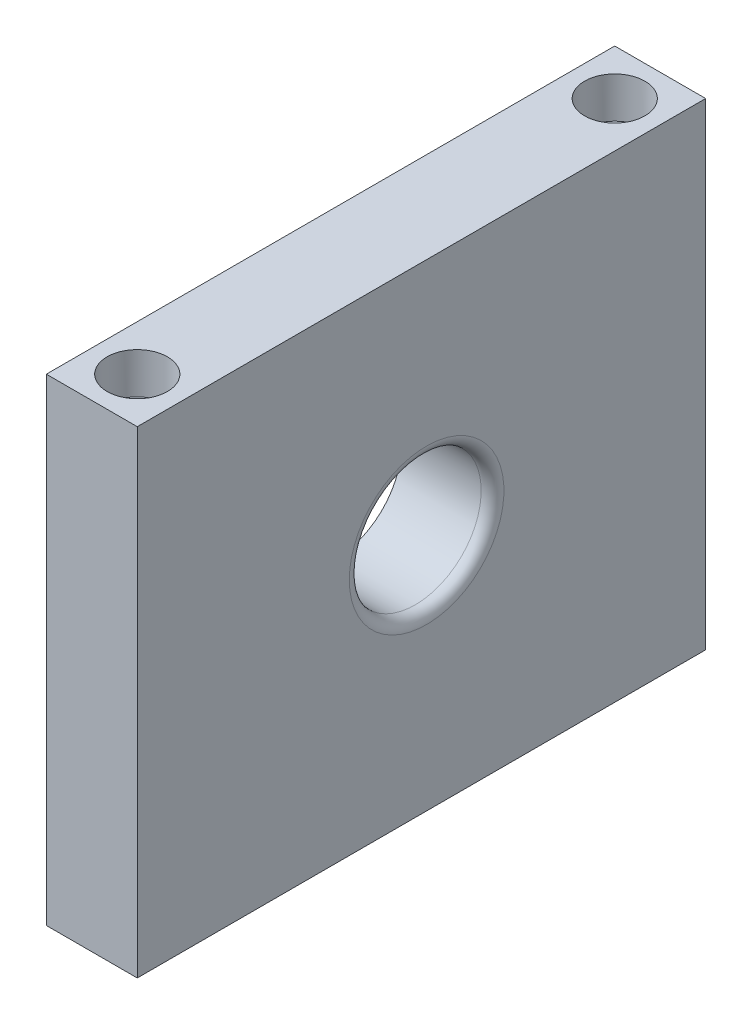
ISO-10303-21;
HEADER;
FILE_DESCRIPTION(('STEP AP214'),'2;1');
FILE_NAME('part.step','',(''),(''),'','','');
FILE_SCHEMA(('AUTOMOTIVE_DESIGN { 1 0 10303 214 1 1 1 1 }'));
ENDSEC;
DATA;
#1=APPLICATION_CONTEXT('core data for automotive mechanical design processes');
#2=APPLICATION_PROTOCOL_DEFINITION('international standard','automotive_design',2000,#1);
#3=PRODUCT_CONTEXT('',#1,'mechanical');
#4=PRODUCT('Part','Part','',(#3));
#5=PRODUCT_RELATED_PRODUCT_CATEGORY('part','',(#4));
#6=PRODUCT_DEFINITION_FORMATION('','',#4);
#7=PRODUCT_DEFINITION_CONTEXT('part definition',#1,'design');
#8=PRODUCT_DEFINITION('design','',#6,#7);
#9=PRODUCT_DEFINITION_SHAPE('','',#8);
#10=(LENGTH_UNIT() NAMED_UNIT(*) SI_UNIT(.MILLI.,.METRE.));
#11=(NAMED_UNIT(*) PLANE_ANGLE_UNIT() SI_UNIT($,.RADIAN.));
#12=(NAMED_UNIT(*) SI_UNIT($,.STERADIAN.) SOLID_ANGLE_UNIT());
#13=UNCERTAINTY_MEASURE_WITH_UNIT(LENGTH_MEASURE(1.E-05),#10,'distance_accuracy_value','');
#14=(GEOMETRIC_REPRESENTATION_CONTEXT(3) GLOBAL_UNCERTAINTY_ASSIGNED_CONTEXT((#13)) GLOBAL_UNIT_ASSIGNED_CONTEXT((#10,
#11,#12)) REPRESENTATION_CONTEXT('',''));
#15=CARTESIAN_POINT('',(0.,0.,0.));
#16=DIRECTION('',(0.,0.,1.));
#17=DIRECTION('',(1.,0.,0.));
#18=AXIS2_PLACEMENT_3D('',#15,#16,#17);
#19=CARTESIAN_POINT('',(-14.2230483271375,-3.6,-32.3847583643123));
#20=DIRECTION('',(0.,1.,0.));
#21=DIRECTION('',(0.,0.,1.));
#22=AXIS2_PLACEMENT_3D('',#19,#20,#21);
#23=PLANE('',#22);
#24=CARTESIAN_POINT('',(-14.2230483271375,-3.6,-32.3847583643123));
#25=DIRECTION('',(0.,1.,0.));
#26=DIRECTION('',(0.,0.,1.));
#27=AXIS2_PLACEMENT_3D('',#24,#25,#26);
#28=CIRCLE('',#27,2.65);
#29=CARTESIAN_POINT('',(-14.2230483271375,-3.6,-29.7347583643123));
#30=VERTEX_POINT('',#29);
#31=EDGE_CURVE('E122',#30,#30,#28,.T.);
#32=ORIENTED_EDGE('',*,*,#31,.T.);
#33=EDGE_LOOP('',(#32));
#34=FACE_BOUND('',#33,.T.);
#35=ADVANCED_FACE('F41',(#34),#23,.T.);
#36=CARTESIAN_POINT('',(-14.2230483271375,-3.6,-32.3847583643123));
#37=DIRECTION('',(0.,1.,0.));
#38=DIRECTION('',(0.,0.,1.));
#39=AXIS2_PLACEMENT_3D('',#36,#37,#38);
#40=CYLINDRICAL_SURFACE('',#39,2.65);
#41=CARTESIAN_POINT('',(-14.2230483271375,0.,-32.3847583643123));
#42=DIRECTION('',(0.,-1.,0.));
#43=DIRECTION('',(0.,0.,-1.));
#44=AXIS2_PLACEMENT_3D('',#41,#42,#43);
#45=CIRCLE('',#44,2.65);
#46=CARTESIAN_POINT('',(-14.2230483271375,0.,-35.0347583643123));
#47=VERTEX_POINT('',#46);
#48=EDGE_CURVE('E162',#47,#47,#45,.F.);
#49=ORIENTED_EDGE('',*,*,#48,.T.);
#50=EDGE_LOOP('',(#49));
#51=FACE_BOUND('',#50,.T.);
#52=ORIENTED_EDGE('',*,*,#31,.F.);
#53=EDGE_LOOP('',(#52));
#54=FACE_BOUND('',#53,.T.);
#55=ADVANCED_FACE('F192',(#51,#54),#40,.F.);
#56=CARTESIAN_POINT('',(14.7769516728625,0.,-36.3847583643123));
#57=DIRECTION('',(0.,-1.,0.));
#58=DIRECTION('',(0.,0.,-1.));
#59=AXIS2_PLACEMENT_3D('',#56,#57,#58);
#60=PLANE('',#59);
#61=DIRECTION('',(0.,0.,1.));
#62=VECTOR('',#61,1.);
#63=CARTESIAN_POINT('',(-18.2230483271375,0.,0.));
#64=LINE('',#63,#62);
#65=CARTESIAN_POINT('',(-18.2230483271376,0.,-36.3847583643123));
#66=VERTEX_POINT('',#65);
#67=CARTESIAN_POINT('',(-18.2230483271375,0.,13.6152416356877));
#68=VERTEX_POINT('',#67);
#69=EDGE_CURVE('E80',#66,#68,#64,.T.);
#70=ORIENTED_EDGE('',*,*,#69,.T.);
#71=DIRECTION('',(1.,0.,0.));
#72=VECTOR('',#71,1.);
#73=CARTESIAN_POINT('',(14.7769516728625,0.,13.6152416356877));
#74=LINE('',#73,#72);
#75=CARTESIAN_POINT('',(-10.2230483271376,0.,13.6152416356877));
#76=VERTEX_POINT('',#75);
#77=EDGE_CURVE('E83',#68,#76,#74,.T.);
#78=ORIENTED_EDGE('',*,*,#77,.T.);
#79=DIRECTION('',(0.,0.,1.));
#80=VECTOR('',#79,1.);
#81=CARTESIAN_POINT('',(-10.2230483271376,0.,-36.3847583643123));
#82=LINE('',#81,#80);
#83=CARTESIAN_POINT('',(-10.2230483271376,0.,-36.3847583643123));
#84=VERTEX_POINT('',#83);
#85=EDGE_CURVE('E119',#84,#76,#82,.T.);
#86=ORIENTED_EDGE('',*,*,#85,.F.);
#87=DIRECTION('',(1.,0.,0.));
#88=VECTOR('',#87,1.);
#89=CARTESIAN_POINT('',(14.7769516728625,0.,-36.3847583643123));
#90=LINE('',#89,#88);
#91=EDGE_CURVE('E86',#66,#84,#90,.T.);
#92=ORIENTED_EDGE('',*,*,#91,.F.);
#93=EDGE_LOOP('',(#70,#78,#86,#92));
#94=FACE_BOUND('',#93,.T.);
#95=CARTESIAN_POINT('',(-14.2230483271375,0.,9.61524163568773));
#96=DIRECTION('',(0.,-1.,0.));
#97=DIRECTION('',(0.,0.,-1.));
#98=AXIS2_PLACEMENT_3D('',#95,#96,#97);
#99=CIRCLE('',#98,2.65);
#100=CARTESIAN_POINT('',(-14.2230483271375,0.,6.96524163568774));
#101=VERTEX_POINT('',#100);
#102=EDGE_CURVE('E91',#101,#101,#99,.F.);
#103=ORIENTED_EDGE('',*,*,#102,.F.);
#104=EDGE_LOOP('',(#103));
#105=FACE_BOUND('',#104,.T.);
#106=ORIENTED_EDGE('',*,*,#48,.F.);
#107=EDGE_LOOP('',(#106));
#108=FACE_BOUND('',#107,.T.);
#109=ADVANCED_FACE('F81',(#94,#105,#108),#60,.F.);
#110=CARTESIAN_POINT('',(-14.2230483271375,-3.6,9.61524163568773));
#111=DIRECTION('',(0.,1.,0.));
#112=DIRECTION('',(0.,0.,1.));
#113=AXIS2_PLACEMENT_3D('',#110,#111,#112);
#114=PLANE('',#113);
#115=CARTESIAN_POINT('',(-14.2230483271375,-3.6,9.61524163568773));
#116=DIRECTION('',(0.,1.,0.));
#117=DIRECTION('',(0.,0.,1.));
#118=AXIS2_PLACEMENT_3D('',#115,#116,#117);
#119=CIRCLE('',#118,2.65);
#120=CARTESIAN_POINT('',(-14.2230483271375,-3.6,12.2652416356877));
#121=VERTEX_POINT('',#120);
#122=EDGE_CURVE('E133',#121,#121,#119,.T.);
#123=ORIENTED_EDGE('',*,*,#122,.T.);
#124=EDGE_LOOP('',(#123));
#125=FACE_BOUND('',#124,.T.);
#126=ADVANCED_FACE('F202',(#125),#114,.T.);
#127=CARTESIAN_POINT('',(-14.2230483271375,-3.6,9.61524163568773));
#128=DIRECTION('',(0.,1.,0.));
#129=DIRECTION('',(0.,0.,1.));
#130=AXIS2_PLACEMENT_3D('',#127,#128,#129);
#131=CYLINDRICAL_SURFACE('',#130,2.65);
#132=ORIENTED_EDGE('',*,*,#102,.T.);
#133=EDGE_LOOP('',(#132));
#134=FACE_BOUND('',#133,.T.);
#135=ORIENTED_EDGE('',*,*,#122,.F.);
#136=EDGE_LOOP('',(#135));
#137=FACE_BOUND('',#136,.T.);
#138=ADVANCED_FACE('F204',(#134,#137),#131,.F.);
#139=CARTESIAN_POINT('',(-10.2230483271375,3.,13.6152416356877));
#140=DIRECTION('',(0.,0.,-1.));
#141=DIRECTION('',(-1.,0.,0.));
#142=AXIS2_PLACEMENT_3D('',#139,#140,#141);
#143=PLANE('',#142);
#144=DIRECTION('',(0.,1.,0.));
#145=VECTOR('',#144,1.);
#146=CARTESIAN_POINT('',(-10.2230483271376,-42.,13.6152416356877));
#147=LINE('',#146,#145);
#148=CARTESIAN_POINT('',(-10.2230483271376,-42.,13.6152416356877));
#149=VERTEX_POINT('',#148);
#150=EDGE_CURVE('E96',#149,#76,#147,.T.);
#151=ORIENTED_EDGE('',*,*,#150,.T.);
#152=ORIENTED_EDGE('',*,*,#77,.F.);
#153=DIRECTION('',(0.,1.,0.));
#154=VECTOR('',#153,1.);
#155=CARTESIAN_POINT('',(-18.2230483271375,3.,13.6152416356877));
#156=LINE('',#155,#154);
#157=CARTESIAN_POINT('',(-18.2230483271376,-42.,13.6152416356877));
#158=VERTEX_POINT('',#157);
#159=EDGE_CURVE('E58',#158,#68,#156,.T.);
#160=ORIENTED_EDGE('',*,*,#159,.F.);
#161=DIRECTION('',(-1.,0.,0.));
#162=VECTOR('',#161,1.);
#163=CARTESIAN_POINT('',(-18.2230483271376,-42.,13.6152416356877));
#164=LINE('',#163,#162);
#165=EDGE_CURVE('E118',#149,#158,#164,.T.);
#166=ORIENTED_EDGE('',*,*,#165,.F.);
#167=EDGE_LOOP('',(#151,#152,#160,#166));
#168=FACE_BOUND('',#167,.T.);
#169=ADVANCED_FACE('F94',(#168),#143,.F.);
#170=CARTESIAN_POINT('',(-10.2230483271376,3.,-36.3847583643123));
#171=DIRECTION('',(0.,0.,1.));
#172=DIRECTION('',(1.,0.,0.));
#173=AXIS2_PLACEMENT_3D('',#170,#171,#172);
#174=PLANE('',#173);
#175=DIRECTION('',(0.,-1.,0.));
#176=VECTOR('',#175,1.);
#177=CARTESIAN_POINT('',(-18.2230483271376,3.,-36.3847583643123));
#178=LINE('',#177,#176);
#179=CARTESIAN_POINT('',(-18.2230483271376,-42.,-36.3847583643123));
#180=VERTEX_POINT('',#179);
#181=EDGE_CURVE('E105',#66,#180,#178,.T.);
#182=ORIENTED_EDGE('',*,*,#181,.F.);
#183=ORIENTED_EDGE('',*,*,#91,.T.);
#184=DIRECTION('',(0.,1.,0.));
#185=VECTOR('',#184,1.);
#186=CARTESIAN_POINT('',(-10.2230483271376,-42.,-36.3847583643123));
#187=LINE('',#186,#185);
#188=CARTESIAN_POINT('',(-10.2230483271376,-42.,-36.3847583643123));
#189=VERTEX_POINT('',#188);
#190=EDGE_CURVE('E110',#189,#84,#187,.T.);
#191=ORIENTED_EDGE('',*,*,#190,.F.);
#192=DIRECTION('',(1.,0.,0.));
#193=VECTOR('',#192,1.);
#194=CARTESIAN_POINT('',(-18.2230483271376,-42.,-36.3847583643123));
#195=LINE('',#194,#193);
#196=EDGE_CURVE('E128',#180,#189,#195,.T.);
#197=ORIENTED_EDGE('',*,*,#196,.F.);
#198=EDGE_LOOP('',(#182,#183,#191,#197));
#199=FACE_BOUND('',#198,.T.);
#200=ADVANCED_FACE('F169',(#199),#174,.F.);
#201=CARTESIAN_POINT('',(-18.2230483271375,0.,0.));
#202=DIRECTION('',(-1.,0.,0.));
#203=DIRECTION('',(0.,0.,1.));
#204=AXIS2_PLACEMENT_3D('',#201,#202,#203);
#205=PLANE('',#204);
#206=ORIENTED_EDGE('',*,*,#69,.F.);
#207=ORIENTED_EDGE('',*,*,#181,.T.);
#208=DIRECTION('',(0.,0.,-1.));
#209=VECTOR('',#208,1.);
#210=CARTESIAN_POINT('',(-18.2230483271376,-42.,-36.3847583643123));
#211=LINE('',#210,#209);
#212=EDGE_CURVE('E103',#158,#180,#211,.T.);
#213=ORIENTED_EDGE('',*,*,#212,.F.);
#214=ORIENTED_EDGE('',*,*,#159,.T.);
#215=EDGE_LOOP('',(#206,#207,#213,#214));
#216=FACE_BOUND('',#215,.T.);
#217=CARTESIAN_POINT('',(-18.2230483271375,-21.,-11.836279123996));
#218=DIRECTION('',(-1.,0.,0.));
#219=DIRECTION('',(0.,0.,1.));
#220=AXIS2_PLACEMENT_3D('',#217,#218,#219);
#221=CIRCLE('',#220,5.80237020535575);
#222=CARTESIAN_POINT('',(-18.2230483271375,-21.,-6.03390891864026));
#223=VERTEX_POINT('',#222);
#224=EDGE_CURVE('E90',#223,#223,#221,.T.);
#225=ORIENTED_EDGE('',*,*,#224,.F.);
#226=EDGE_LOOP('',(#225));
#227=FACE_BOUND('',#226,.T.);
#228=ADVANCED_FACE('F100',(#216,#227),#205,.T.);
#229=CARTESIAN_POINT('',(-10.2230483271376,-42.,-36.3847583643123));
#230=DIRECTION('',(-1.,0.,0.));
#231=DIRECTION('',(0.,0.,1.));
#232=AXIS2_PLACEMENT_3D('',#229,#230,#231);
#233=PLANE('',#232);
#234=CARTESIAN_POINT('',(-10.2230483271376,-21.,-11.836279123996));
#235=DIRECTION('',(-1.,0.,0.));
#236=DIRECTION('',(0.,0.,1.));
#237=AXIS2_PLACEMENT_3D('',#234,#235,#236);
#238=CIRCLE('',#237,6.80237020535575);
#239=CARTESIAN_POINT('',(-10.2230483271376,-21.,-5.03390891864026));
#240=VERTEX_POINT('',#239);
#241=EDGE_CURVE('E51',#240,#240,#238,.T.);
#242=ORIENTED_EDGE('',*,*,#241,.T.);
#243=EDGE_LOOP('',(#242));
#244=FACE_BOUND('',#243,.T.);
#245=ORIENTED_EDGE('',*,*,#85,.T.);
#246=ORIENTED_EDGE('',*,*,#150,.F.);
#247=DIRECTION('',(0.,0.,1.));
#248=VECTOR('',#247,1.);
#249=CARTESIAN_POINT('',(-10.2230483271376,-42.,-36.3847583643123));
#250=LINE('',#249,#248);
#251=EDGE_CURVE('E125',#189,#149,#250,.T.);
#252=ORIENTED_EDGE('',*,*,#251,.F.);
#253=ORIENTED_EDGE('',*,*,#190,.T.);
#254=EDGE_LOOP('',(#245,#246,#252,#253));
#255=FACE_BOUND('',#254,.T.);
#256=ADVANCED_FACE('F173',(#244,#255),#233,.F.);
#257=CARTESIAN_POINT('',(0.,-42.,0.));
#258=DIRECTION('',(0.,1.,0.));
#259=DIRECTION('',(0.,0.,1.));
#260=AXIS2_PLACEMENT_3D('',#257,#258,#259);
#261=PLANE('',#260);
#262=CARTESIAN_POINT('',(-14.2230483271375,-42.,-32.3847583643123));
#263=DIRECTION('',(0.,1.,0.));
#264=DIRECTION('',(0.,0.,1.));
#265=AXIS2_PLACEMENT_3D('',#262,#263,#264);
#266=CIRCLE('',#265,2.65);
#267=CARTESIAN_POINT('',(-14.2230483271375,-42.,-29.7347583643123));
#268=VERTEX_POINT('',#267);
#269=EDGE_CURVE('E149',#268,#268,#266,.T.);
#270=ORIENTED_EDGE('',*,*,#269,.T.);
#271=EDGE_LOOP('',(#270));
#272=FACE_BOUND('',#271,.T.);
#273=CARTESIAN_POINT('',(-14.2230483271375,-42.,9.61524163568773));
#274=DIRECTION('',(0.,1.,0.));
#275=DIRECTION('',(0.,0.,1.));
#276=AXIS2_PLACEMENT_3D('',#273,#274,#275);
#277=CIRCLE('',#276,2.65);
#278=CARTESIAN_POINT('',(-14.2230483271375,-42.,12.2652416356877));
#279=VERTEX_POINT('',#278);
#280=EDGE_CURVE('E141',#279,#279,#277,.T.);
#281=ORIENTED_EDGE('',*,*,#280,.T.);
#282=EDGE_LOOP('',(#281));
#283=FACE_BOUND('',#282,.T.);
#284=ORIENTED_EDGE('',*,*,#212,.T.);
#285=ORIENTED_EDGE('',*,*,#196,.T.);
#286=ORIENTED_EDGE('',*,*,#251,.T.);
#287=ORIENTED_EDGE('',*,*,#165,.T.);
#288=EDGE_LOOP('',(#284,#285,#286,#287));
#289=FACE_BOUND('',#288,.T.);
#290=ADVANCED_FACE('F175',(#272,#283,#289),#261,.F.);
#291=CARTESIAN_POINT('',(-14.2230483271375,-35.4,9.61524163568773));
#292=DIRECTION('',(0.,-1.,0.));
#293=DIRECTION('',(0.,0.,-1.));
#294=AXIS2_PLACEMENT_3D('',#291,#292,#293);
#295=CYLINDRICAL_SURFACE('',#294,2.65);
#296=CARTESIAN_POINT('',(-14.2230483271375,-35.4,9.61524163568773));
#297=DIRECTION('',(0.,1.,0.));
#298=DIRECTION('',(0.,0.,1.));
#299=AXIS2_PLACEMENT_3D('',#296,#297,#298);
#300=CIRCLE('',#299,2.65);
#301=CARTESIAN_POINT('',(-14.2230483271375,-35.4,12.2652416356877));
#302=VERTEX_POINT('',#301);
#303=EDGE_CURVE('E145',#302,#302,#300,.T.);
#304=ORIENTED_EDGE('',*,*,#303,.T.);
#305=EDGE_LOOP('',(#304));
#306=FACE_BOUND('',#305,.T.);
#307=ORIENTED_EDGE('',*,*,#280,.F.);
#308=EDGE_LOOP('',(#307));
#309=FACE_BOUND('',#308,.T.);
#310=ADVANCED_FACE('F177',(#306,#309),#295,.F.);
#311=CARTESIAN_POINT('',(-14.2230483271375,-35.4,9.61524163568773));
#312=DIRECTION('',(0.,-1.,0.));
#313=DIRECTION('',(0.,0.,1.));
#314=AXIS2_PLACEMENT_3D('',#311,#312,#313);
#315=PLANE('',#314);
#316=ORIENTED_EDGE('',*,*,#303,.F.);
#317=EDGE_LOOP('',(#316));
#318=FACE_BOUND('',#317,.T.);
#319=ADVANCED_FACE('F184',(#318),#315,.T.);
#320=CARTESIAN_POINT('',(-14.2230483271375,-35.4,-32.3847583643123));
#321=DIRECTION('',(0.,-1.,0.));
#322=DIRECTION('',(0.,0.,-1.));
#323=AXIS2_PLACEMENT_3D('',#320,#321,#322);
#324=CYLINDRICAL_SURFACE('',#323,2.65);
#325=CARTESIAN_POINT('',(-14.2230483271375,-35.4,-32.3847583643123));
#326=DIRECTION('',(0.,1.,0.));
#327=DIRECTION('',(0.,0.,1.));
#328=AXIS2_PLACEMENT_3D('',#325,#326,#327);
#329=CIRCLE('',#328,2.65);
#330=CARTESIAN_POINT('',(-14.2230483271375,-35.4,-29.7347583643123));
#331=VERTEX_POINT('',#330);
#332=EDGE_CURVE('E137',#331,#331,#329,.T.);
#333=ORIENTED_EDGE('',*,*,#332,.T.);
#334=EDGE_LOOP('',(#333));
#335=FACE_BOUND('',#334,.T.);
#336=ORIENTED_EDGE('',*,*,#269,.F.);
#337=EDGE_LOOP('',(#336));
#338=FACE_BOUND('',#337,.T.);
#339=ADVANCED_FACE('F230',(#335,#338),#324,.F.);
#340=CARTESIAN_POINT('',(-14.2230483271375,-35.4,-32.3847583643123));
#341=DIRECTION('',(0.,-1.,0.));
#342=DIRECTION('',(0.,0.,1.));
#343=AXIS2_PLACEMENT_3D('',#340,#341,#342);
#344=PLANE('',#343);
#345=ORIENTED_EDGE('',*,*,#332,.F.);
#346=EDGE_LOOP('',(#345));
#347=FACE_BOUND('',#346,.T.);
#348=ADVANCED_FACE('F226',(#347),#344,.T.);
#349=CARTESIAN_POINT('',(-9.22304832713755,-21.,-11.836279123996));
#350=DIRECTION('',(-1.,0.,0.));
#351=DIRECTION('',(0.,0.,1.));
#352=AXIS2_PLACEMENT_3D('',#349,#350,#351);
#353=CYLINDRICAL_SURFACE('',#352,5.80237020535575);
#354=CARTESIAN_POINT('',(-11.2230483271376,-21.,-11.836279123996));
#355=DIRECTION('',(-1.,0.,0.));
#356=DIRECTION('',(0.,0.,1.));
#357=AXIS2_PLACEMENT_3D('',#354,#355,#356);
#358=CIRCLE('',#357,5.80237020535575);
#359=CARTESIAN_POINT('',(-11.2230483271376,-21.,-6.03390891864026));
#360=VERTEX_POINT('',#359);
#361=EDGE_CURVE('E11',#360,#360,#358,.F.);
#362=ORIENTED_EDGE('',*,*,#361,.T.);
#363=EDGE_LOOP('',(#362));
#364=FACE_BOUND('',#363,.T.);
#365=ORIENTED_EDGE('',*,*,#224,.T.);
#366=EDGE_LOOP('',(#365));
#367=FACE_BOUND('',#366,.T.);
#368=ADVANCED_FACE('F223',(#364,#367),#353,.F.);
#369=CARTESIAN_POINT('',(-11.2230483271376,-21.,-11.836279123996));
#370=DIRECTION('',(-1.,0.,0.));
#371=DIRECTION('',(0.,0.,1.));
#372=AXIS2_PLACEMENT_3D('',#369,#370,#371);
#373=TOROIDAL_SURFACE('',#372,6.80237020535575,1.);
#374=ORIENTED_EDGE('',*,*,#361,.F.);
#375=EDGE_LOOP('',(#374));
#376=FACE_BOUND('',#375,.T.);
#377=ORIENTED_EDGE('',*,*,#241,.F.);
#378=EDGE_LOOP('',(#377));
#379=FACE_BOUND('',#378,.T.);
#380=ADVANCED_FACE('F43',(#376,#379),#373,.T.);
#381=CLOSED_SHELL('',(#35,#55,#109,#126,#138,#169,#200,#228,#256,#290,#310,#319,#339,#348,#368,#380));
#382=MANIFOLD_SOLID_BREP('B2',#381);
#383=ADVANCED_BREP_SHAPE_REPRESENTATION('',(#18,#382),#14);
#384=SHAPE_DEFINITION_REPRESENTATION(#9,#383);
ENDSEC;
END-ISO-10303-21;
